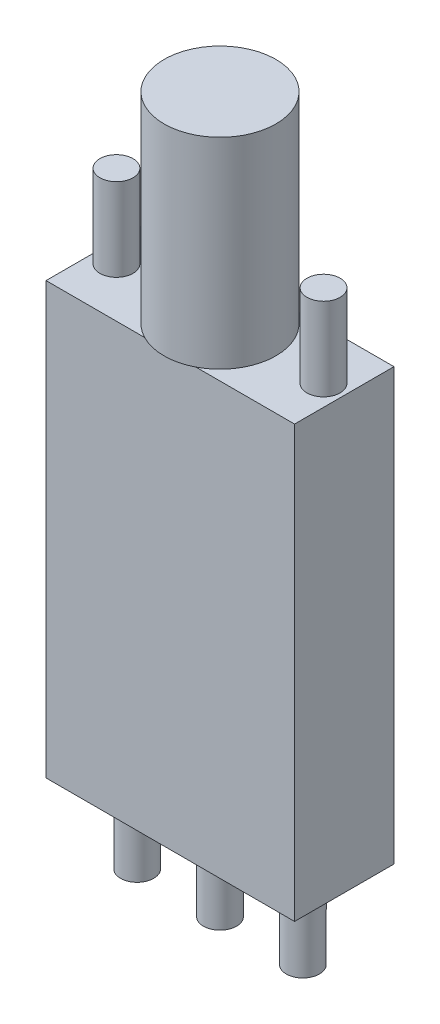
ISO-10303-21;
HEADER;
FILE_DESCRIPTION(('STEP AP214'),'2;1');
FILE_NAME('part.step','',(''),(''),'','','');
FILE_SCHEMA(('AUTOMOTIVE_DESIGN { 1 0 10303 214 1 1 1 1 }'));
ENDSEC;
DATA;
#1=APPLICATION_CONTEXT('core data for automotive mechanical design processes');
#2=APPLICATION_PROTOCOL_DEFINITION('international standard','automotive_design',2000,#1);
#3=PRODUCT_CONTEXT('',#1,'mechanical');
#4=PRODUCT('Part','Part','',(#3));
#5=PRODUCT_RELATED_PRODUCT_CATEGORY('part','',(#4));
#6=PRODUCT_DEFINITION_FORMATION('','',#4);
#7=PRODUCT_DEFINITION_CONTEXT('part definition',#1,'design');
#8=PRODUCT_DEFINITION('design','',#6,#7);
#9=PRODUCT_DEFINITION_SHAPE('','',#8);
#10=(LENGTH_UNIT() NAMED_UNIT(*) SI_UNIT(.MILLI.,.METRE.));
#11=(NAMED_UNIT(*) PLANE_ANGLE_UNIT() SI_UNIT($,.RADIAN.));
#12=(NAMED_UNIT(*) SI_UNIT($,.STERADIAN.) SOLID_ANGLE_UNIT());
#13=UNCERTAINTY_MEASURE_WITH_UNIT(LENGTH_MEASURE(1.E-05),#10,'distance_accuracy_value','');
#14=(GEOMETRIC_REPRESENTATION_CONTEXT(3) GLOBAL_UNCERTAINTY_ASSIGNED_CONTEXT((#13)) GLOBAL_UNIT_ASSIGNED_CONTEXT((#10,
#11,#12)) REPRESENTATION_CONTEXT('',''));
#15=CARTESIAN_POINT('',(0.,0.,0.));
#16=DIRECTION('',(0.,0.,1.));
#17=DIRECTION('',(1.,0.,0.));
#18=AXIS2_PLACEMENT_3D('',#15,#16,#17);
#19=CARTESIAN_POINT('',(-7.5,13.,6.));
#20=DIRECTION('',(0.,-1.,0.));
#21=DIRECTION('',(0.,0.,-1.));
#22=AXIS2_PLACEMENT_3D('',#19,#20,#21);
#23=PLANE('',#22);
#24=CARTESIAN_POINT('',(-6.25,13.,3.));
#25=DIRECTION('',(0.,-1.,0.));
#26=DIRECTION('',(0.,0.,-1.));
#27=AXIS2_PLACEMENT_3D('',#24,#25,#26);
#28=CIRCLE('',#27,1.);
#29=CARTESIAN_POINT('',(-6.25,13.,2.));
#30=VERTEX_POINT('',#29);
#31=EDGE_CURVE('E158',#30,#30,#28,.F.);
#32=ORIENTED_EDGE('',*,*,#31,.F.);
#33=EDGE_LOOP('',(#32));
#34=FACE_BOUND('',#33,.T.);
#35=CARTESIAN_POINT('',(0.,13.,3.));
#36=DIRECTION('',(0.,1.,0.));
#37=DIRECTION('',(0.,0.,1.));
#38=AXIS2_PLACEMENT_3D('',#35,#36,#37);
#39=CIRCLE('',#38,3.375);
#40=CARTESIAN_POINT('',(-1.54616460960662,13.,0.));
#41=VERTEX_POINT('',#40);
#42=CARTESIAN_POINT('',(-1.54616460960663,13.,6.));
#43=VERTEX_POINT('',#42);
#44=EDGE_CURVE('E101',#41,#43,#39,.T.);
#45=ORIENTED_EDGE('',*,*,#44,.F.);
#46=DIRECTION('',(-1.,0.,0.));
#47=VECTOR('',#46,1.);
#48=CARTESIAN_POINT('',(-7.5,13.,0.));
#49=LINE('',#48,#47);
#50=CARTESIAN_POINT('',(-7.5,13.,0.));
#51=VERTEX_POINT('',#50);
#52=EDGE_CURVE('E89',#41,#51,#49,.T.);
#53=ORIENTED_EDGE('',*,*,#52,.T.);
#54=DIRECTION('',(0.,0.,-1.));
#55=VECTOR('',#54,1.);
#56=CARTESIAN_POINT('',(-7.5,13.,6.));
#57=LINE('',#56,#55);
#58=CARTESIAN_POINT('',(-7.5,13.,6.));
#59=VERTEX_POINT('',#58);
#60=EDGE_CURVE('E153',#59,#51,#57,.T.);
#61=ORIENTED_EDGE('',*,*,#60,.F.);
#62=DIRECTION('',(-1.,0.,0.));
#63=VECTOR('',#62,1.);
#64=CARTESIAN_POINT('',(-7.5,13.,6.));
#65=LINE('',#64,#63);
#66=EDGE_CURVE('E50',#43,#59,#65,.T.);
#67=ORIENTED_EDGE('',*,*,#66,.F.);
#68=EDGE_LOOP('',(#45,#53,#61,#67));
#69=FACE_BOUND('',#68,.T.);
#70=ADVANCED_FACE('F35',(#34,#69),#23,.F.);
#71=CARTESIAN_POINT('',(6.25,13.,3.));
#72=DIRECTION('',(0.,-1.,0.));
#73=DIRECTION('',(0.,0.,-1.));
#74=AXIS2_PLACEMENT_3D('',#71,#72,#73);
#75=CIRCLE('',#74,1.);
#76=CARTESIAN_POINT('',(6.25,13.,2.));
#77=VERTEX_POINT('',#76);
#78=EDGE_CURVE('E161',#77,#77,#75,.F.);
#79=ORIENTED_EDGE('',*,*,#78,.F.);
#80=EDGE_LOOP('',(#79));
#81=FACE_BOUND('',#80,.T.);
#82=CARTESIAN_POINT('',(1.54616460960663,13.,6.));
#83=VERTEX_POINT('',#82);
#84=CARTESIAN_POINT('',(1.54616460960662,13.,0.));
#85=VERTEX_POINT('',#84);
#86=EDGE_CURVE('E58',#83,#85,#39,.T.);
#87=ORIENTED_EDGE('',*,*,#86,.F.);
#88=CARTESIAN_POINT('',(7.5,13.,6.));
#89=VERTEX_POINT('',#88);
#90=EDGE_CURVE('E137',#89,#83,#65,.T.);
#91=ORIENTED_EDGE('',*,*,#90,.F.);
#92=DIRECTION('',(0.,0.,-1.));
#93=VECTOR('',#92,1.);
#94=CARTESIAN_POINT('',(7.5,13.,6.));
#95=LINE('',#94,#93);
#96=CARTESIAN_POINT('',(7.5,13.,0.));
#97=VERTEX_POINT('',#96);
#98=EDGE_CURVE('E155',#89,#97,#95,.T.);
#99=ORIENTED_EDGE('',*,*,#98,.T.);
#100=EDGE_CURVE('E99',#97,#85,#49,.T.);
#101=ORIENTED_EDGE('',*,*,#100,.T.);
#102=EDGE_LOOP('',(#87,#91,#99,#101));
#103=FACE_BOUND('',#102,.T.);
#104=ADVANCED_FACE('F174',(#81,#103),#23,.F.);
#105=CARTESIAN_POINT('',(-7.5,-13.,6.));
#106=DIRECTION('',(0.,1.,0.));
#107=DIRECTION('',(0.,0.,1.));
#108=AXIS2_PLACEMENT_3D('',#105,#106,#107);
#109=PLANE('',#108);
#110=CARTESIAN_POINT('',(5.,-13.,3.00000000000007));
#111=DIRECTION('',(0.,1.,0.));
#112=DIRECTION('',(0.,0.,1.));
#113=AXIS2_PLACEMENT_3D('',#110,#111,#112);
#114=CIRCLE('',#113,1.);
#115=CARTESIAN_POINT('',(5.,-13.,4.00000000000007));
#116=VERTEX_POINT('',#115);
#117=EDGE_CURVE('E43',#116,#116,#114,.F.);
#118=ORIENTED_EDGE('',*,*,#117,.F.);
#119=EDGE_LOOP('',(#118));
#120=FACE_BOUND('',#119,.T.);
#121=DIRECTION('',(1.,0.,0.));
#122=VECTOR('',#121,1.);
#123=CARTESIAN_POINT('',(-7.5,-13.,0.));
#124=LINE('',#123,#122);
#125=CARTESIAN_POINT('',(-7.5,-13.,0.));
#126=VERTEX_POINT('',#125);
#127=CARTESIAN_POINT('',(7.5,-13.,0.));
#128=VERTEX_POINT('',#127);
#129=EDGE_CURVE('E136',#126,#128,#124,.T.);
#130=ORIENTED_EDGE('',*,*,#129,.T.);
#131=DIRECTION('',(0.,0.,-1.));
#132=VECTOR('',#131,1.);
#133=CARTESIAN_POINT('',(7.5,-13.,6.));
#134=LINE('',#133,#132);
#135=CARTESIAN_POINT('',(7.5,-13.,6.));
#136=VERTEX_POINT('',#135);
#137=EDGE_CURVE('E143',#136,#128,#134,.T.);
#138=ORIENTED_EDGE('',*,*,#137,.F.);
#139=DIRECTION('',(1.,0.,0.));
#140=VECTOR('',#139,1.);
#141=CARTESIAN_POINT('',(-7.5,-13.,6.));
#142=LINE('',#141,#140);
#143=CARTESIAN_POINT('',(-7.5,-13.,6.));
#144=VERTEX_POINT('',#143);
#145=EDGE_CURVE('E141',#144,#136,#142,.T.);
#146=ORIENTED_EDGE('',*,*,#145,.F.);
#147=DIRECTION('',(0.,0.,-1.));
#148=VECTOR('',#147,1.);
#149=CARTESIAN_POINT('',(-7.5,-13.,6.));
#150=LINE('',#149,#148);
#151=EDGE_CURVE('E150',#144,#126,#150,.T.);
#152=ORIENTED_EDGE('',*,*,#151,.T.);
#153=EDGE_LOOP('',(#130,#138,#146,#152));
#154=FACE_BOUND('',#153,.T.);
#155=CARTESIAN_POINT('',(0.,-13.,3.));
#156=DIRECTION('',(0.,1.,0.));
#157=DIRECTION('',(0.,0.,1.));
#158=AXIS2_PLACEMENT_3D('',#155,#156,#157);
#159=CIRCLE('',#158,1.);
#160=CARTESIAN_POINT('',(0.,-13.,4.));
#161=VERTEX_POINT('',#160);
#162=EDGE_CURVE('E164',#161,#161,#159,.F.);
#163=ORIENTED_EDGE('',*,*,#162,.F.);
#164=EDGE_LOOP('',(#163));
#165=FACE_BOUND('',#164,.T.);
#166=CARTESIAN_POINT('',(-5.,-13.,2.99999999999996));
#167=DIRECTION('',(0.,1.,0.));
#168=DIRECTION('',(0.,0.,1.));
#169=AXIS2_PLACEMENT_3D('',#166,#167,#168);
#170=CIRCLE('',#169,1.);
#171=CARTESIAN_POINT('',(-5.,-13.,3.99999999999996));
#172=VERTEX_POINT('',#171);
#173=EDGE_CURVE('E11',#172,#172,#170,.F.);
#174=ORIENTED_EDGE('',*,*,#173,.F.);
#175=EDGE_LOOP('',(#174));
#176=FACE_BOUND('',#175,.T.);
#177=ADVANCED_FACE('F171',(#120,#154,#165,#176),#109,.F.);
#178=CARTESIAN_POINT('',(7.5,-13.,6.));
#179=DIRECTION('',(-1.,0.,0.));
#180=DIRECTION('',(0.,0.,1.));
#181=AXIS2_PLACEMENT_3D('',#178,#179,#180);
#182=PLANE('',#181);
#183=DIRECTION('',(0.,1.,0.));
#184=VECTOR('',#183,1.);
#185=CARTESIAN_POINT('',(7.5,-13.,0.));
#186=LINE('',#185,#184);
#187=EDGE_CURVE('E97',#128,#97,#186,.T.);
#188=ORIENTED_EDGE('',*,*,#187,.T.);
#189=ORIENTED_EDGE('',*,*,#98,.F.);
#190=DIRECTION('',(0.,1.,0.));
#191=VECTOR('',#190,1.);
#192=CARTESIAN_POINT('',(7.5,-13.,6.));
#193=LINE('',#192,#191);
#194=EDGE_CURVE('E133',#136,#89,#193,.T.);
#195=ORIENTED_EDGE('',*,*,#194,.F.);
#196=ORIENTED_EDGE('',*,*,#137,.T.);
#197=EDGE_LOOP('',(#188,#189,#195,#196));
#198=FACE_BOUND('',#197,.T.);
#199=ADVANCED_FACE('F37',(#198),#182,.F.);
#200=CARTESIAN_POINT('',(-7.5,-13.,6.));
#201=DIRECTION('',(1.,0.,0.));
#202=DIRECTION('',(0.,0.,-1.));
#203=AXIS2_PLACEMENT_3D('',#200,#201,#202);
#204=PLANE('',#203);
#205=DIRECTION('',(0.,-1.,0.));
#206=VECTOR('',#205,1.);
#207=CARTESIAN_POINT('',(-7.5,-13.,0.));
#208=LINE('',#207,#206);
#209=EDGE_CURVE('E95',#51,#126,#208,.T.);
#210=ORIENTED_EDGE('',*,*,#209,.T.);
#211=ORIENTED_EDGE('',*,*,#151,.F.);
#212=DIRECTION('',(0.,-1.,0.));
#213=VECTOR('',#212,1.);
#214=CARTESIAN_POINT('',(-7.5,-13.,6.));
#215=LINE('',#214,#213);
#216=EDGE_CURVE('E139',#59,#144,#215,.T.);
#217=ORIENTED_EDGE('',*,*,#216,.F.);
#218=ORIENTED_EDGE('',*,*,#60,.T.);
#219=EDGE_LOOP('',(#210,#211,#217,#218));
#220=FACE_BOUND('',#219,.T.);
#221=ADVANCED_FACE('F207',(#220),#204,.F.);
#222=CARTESIAN_POINT('',(0.,0.,6.));
#223=DIRECTION('',(0.,0.,-1.));
#224=DIRECTION('',(-1.,0.,0.));
#225=AXIS2_PLACEMENT_3D('',#222,#223,#224);
#226=PLANE('',#225);
#227=ORIENTED_EDGE('',*,*,#194,.T.);
#228=ORIENTED_EDGE('',*,*,#90,.T.);
#229=DIRECTION('',(1.,0.,0.));
#230=VECTOR('',#229,1.);
#231=CARTESIAN_POINT('',(0.,13.,6.));
#232=LINE('',#231,#230);
#233=EDGE_CURVE('E115',#43,#83,#232,.T.);
#234=ORIENTED_EDGE('',*,*,#233,.F.);
#235=ORIENTED_EDGE('',*,*,#66,.T.);
#236=ORIENTED_EDGE('',*,*,#216,.T.);
#237=ORIENTED_EDGE('',*,*,#145,.T.);
#238=EDGE_LOOP('',(#227,#228,#234,#235,#236,#237));
#239=FACE_BOUND('',#238,.T.);
#240=ADVANCED_FACE('F209',(#239),#226,.F.);
#241=CARTESIAN_POINT('',(0.,0.,0.));
#242=DIRECTION('',(0.,0.,-1.));
#243=DIRECTION('',(-1.,0.,0.));
#244=AXIS2_PLACEMENT_3D('',#241,#242,#243);
#245=PLANE('',#244);
#246=ORIENTED_EDGE('',*,*,#187,.F.);
#247=ORIENTED_EDGE('',*,*,#129,.F.);
#248=ORIENTED_EDGE('',*,*,#209,.F.);
#249=ORIENTED_EDGE('',*,*,#52,.F.);
#250=EDGE_CURVE('E93',#85,#41,#49,.T.);
#251=ORIENTED_EDGE('',*,*,#250,.F.);
#252=ORIENTED_EDGE('',*,*,#100,.F.);
#253=EDGE_LOOP('',(#246,#247,#248,#249,#251,#252));
#254=FACE_BOUND('',#253,.T.);
#255=ADVANCED_FACE('F91',(#254),#245,.T.);
#256=CARTESIAN_POINT('',(-6.25,18.,3.));
#257=DIRECTION('',(0.,-1.,0.));
#258=DIRECTION('',(0.,0.,-1.));
#259=AXIS2_PLACEMENT_3D('',#256,#257,#258);
#260=CYLINDRICAL_SURFACE('',#259,1.);
#261=CARTESIAN_POINT('',(-6.25,18.,3.));
#262=DIRECTION('',(0.,1.,0.));
#263=DIRECTION('',(0.,0.,1.));
#264=AXIS2_PLACEMENT_3D('',#261,#262,#263);
#265=CIRCLE('',#264,1.);
#266=CARTESIAN_POINT('',(-6.25,18.,4.));
#267=VERTEX_POINT('',#266);
#268=EDGE_CURVE('E130',#267,#267,#265,.T.);
#269=ORIENTED_EDGE('',*,*,#268,.F.);
#270=EDGE_LOOP('',(#269));
#271=FACE_BOUND('',#270,.T.);
#272=ORIENTED_EDGE('',*,*,#31,.T.);
#273=EDGE_LOOP('',(#272));
#274=FACE_BOUND('',#273,.T.);
#275=ADVANCED_FACE('F214',(#271,#274),#260,.T.);
#276=CARTESIAN_POINT('',(-6.25,18.,3.));
#277=DIRECTION('',(0.,1.,0.));
#278=DIRECTION('',(0.,0.,1.));
#279=AXIS2_PLACEMENT_3D('',#276,#277,#278);
#280=PLANE('',#279);
#281=ORIENTED_EDGE('',*,*,#268,.T.);
#282=EDGE_LOOP('',(#281));
#283=FACE_BOUND('',#282,.T.);
#284=ADVANCED_FACE('F220',(#283),#280,.T.);
#285=CARTESIAN_POINT('',(6.25,18.,3.));
#286=DIRECTION('',(0.,-1.,0.));
#287=DIRECTION('',(0.,0.,-1.));
#288=AXIS2_PLACEMENT_3D('',#285,#286,#287);
#289=CYLINDRICAL_SURFACE('',#288,1.);
#290=CARTESIAN_POINT('',(6.25,18.,3.));
#291=DIRECTION('',(0.,1.,0.));
#292=DIRECTION('',(0.,0.,-1.));
#293=AXIS2_PLACEMENT_3D('',#290,#291,#292);
#294=CIRCLE('',#293,1.);
#295=CARTESIAN_POINT('',(6.25,18.,2.));
#296=VERTEX_POINT('',#295);
#297=EDGE_CURVE('E127',#296,#296,#294,.T.);
#298=ORIENTED_EDGE('',*,*,#297,.F.);
#299=EDGE_LOOP('',(#298));
#300=FACE_BOUND('',#299,.T.);
#301=ORIENTED_EDGE('',*,*,#78,.T.);
#302=EDGE_LOOP('',(#301));
#303=FACE_BOUND('',#302,.T.);
#304=ADVANCED_FACE('F224',(#300,#303),#289,.T.);
#305=CARTESIAN_POINT('',(6.25,18.,3.));
#306=DIRECTION('',(0.,-1.,0.));
#307=DIRECTION('',(0.,0.,-1.));
#308=AXIS2_PLACEMENT_3D('',#305,#306,#307);
#309=PLANE('',#308);
#310=ORIENTED_EDGE('',*,*,#297,.T.);
#311=EDGE_LOOP('',(#310));
#312=FACE_BOUND('',#311,.T.);
#313=ADVANCED_FACE('F228',(#312),#309,.F.);
#314=CARTESIAN_POINT('',(0.,-18.,3.));
#315=DIRECTION('',(0.,1.,0.));
#316=DIRECTION('',(0.,0.,1.));
#317=AXIS2_PLACEMENT_3D('',#314,#315,#316);
#318=CYLINDRICAL_SURFACE('',#317,1.);
#319=CARTESIAN_POINT('',(0.,-18.,3.));
#320=DIRECTION('',(0.,-1.,0.));
#321=DIRECTION('',(0.,0.,-1.));
#322=AXIS2_PLACEMENT_3D('',#319,#320,#321);
#323=CIRCLE('',#322,1.);
#324=CARTESIAN_POINT('',(0.,-18.,2.));
#325=VERTEX_POINT('',#324);
#326=EDGE_CURVE('E124',#325,#325,#323,.T.);
#327=ORIENTED_EDGE('',*,*,#326,.F.);
#328=EDGE_LOOP('',(#327));
#329=FACE_BOUND('',#328,.T.);
#330=ORIENTED_EDGE('',*,*,#162,.T.);
#331=EDGE_LOOP('',(#330));
#332=FACE_BOUND('',#331,.T.);
#333=ADVANCED_FACE('F232',(#329,#332),#318,.T.);
#334=CARTESIAN_POINT('',(0.,-18.,3.));
#335=DIRECTION('',(0.,-1.,0.));
#336=DIRECTION('',(0.,0.,-1.));
#337=AXIS2_PLACEMENT_3D('',#334,#335,#336);
#338=PLANE('',#337);
#339=ORIENTED_EDGE('',*,*,#326,.T.);
#340=EDGE_LOOP('',(#339));
#341=FACE_BOUND('',#340,.T.);
#342=ADVANCED_FACE('F236',(#341),#338,.T.);
#343=CARTESIAN_POINT('',(5.,-18.,3.00000000000007));
#344=DIRECTION('',(0.,1.,0.));
#345=DIRECTION('',(0.,0.,1.));
#346=AXIS2_PLACEMENT_3D('',#343,#344,#345);
#347=CYLINDRICAL_SURFACE('',#346,1.);
#348=CARTESIAN_POINT('',(5.,-18.,3.00000000000007));
#349=DIRECTION('',(0.,-1.,0.));
#350=DIRECTION('',(0.,0.,-1.));
#351=AXIS2_PLACEMENT_3D('',#348,#349,#350);
#352=CIRCLE('',#351,1.);
#353=CARTESIAN_POINT('',(5.,-18.,2.00000000000007));
#354=VERTEX_POINT('',#353);
#355=EDGE_CURVE('E121',#354,#354,#352,.T.);
#356=ORIENTED_EDGE('',*,*,#355,.F.);
#357=EDGE_LOOP('',(#356));
#358=FACE_BOUND('',#357,.T.);
#359=ORIENTED_EDGE('',*,*,#117,.T.);
#360=EDGE_LOOP('',(#359));
#361=FACE_BOUND('',#360,.T.);
#362=ADVANCED_FACE('F169',(#358,#361),#347,.T.);
#363=CARTESIAN_POINT('',(5.,-18.,3.00000000000007));
#364=DIRECTION('',(0.,-1.,0.));
#365=DIRECTION('',(0.,0.,-1.));
#366=AXIS2_PLACEMENT_3D('',#363,#364,#365);
#367=PLANE('',#366);
#368=ORIENTED_EDGE('',*,*,#355,.T.);
#369=EDGE_LOOP('',(#368));
#370=FACE_BOUND('',#369,.T.);
#371=ADVANCED_FACE('F185',(#370),#367,.T.);
#372=CARTESIAN_POINT('',(-5.,-18.,2.99999999999996));
#373=DIRECTION('',(0.,1.,0.));
#374=DIRECTION('',(0.,0.,1.));
#375=AXIS2_PLACEMENT_3D('',#372,#373,#374);
#376=CYLINDRICAL_SURFACE('',#375,1.);
#377=CARTESIAN_POINT('',(-5.,-18.,2.99999999999996));
#378=DIRECTION('',(0.,-1.,0.));
#379=DIRECTION('',(0.,0.,-1.));
#380=AXIS2_PLACEMENT_3D('',#377,#378,#379);
#381=CIRCLE('',#380,1.);
#382=CARTESIAN_POINT('',(-5.,-18.,1.99999999999997));
#383=VERTEX_POINT('',#382);
#384=EDGE_CURVE('E118',#383,#383,#381,.T.);
#385=ORIENTED_EDGE('',*,*,#384,.F.);
#386=EDGE_LOOP('',(#385));
#387=FACE_BOUND('',#386,.T.);
#388=ORIENTED_EDGE('',*,*,#173,.T.);
#389=EDGE_LOOP('',(#388));
#390=FACE_BOUND('',#389,.T.);
#391=ADVANCED_FACE('F182',(#387,#390),#376,.T.);
#392=CARTESIAN_POINT('',(-5.,-18.,2.99999999999996));
#393=DIRECTION('',(0.,-1.,0.));
#394=DIRECTION('',(0.,0.,-1.));
#395=AXIS2_PLACEMENT_3D('',#392,#393,#394);
#396=PLANE('',#395);
#397=ORIENTED_EDGE('',*,*,#384,.T.);
#398=EDGE_LOOP('',(#397));
#399=FACE_BOUND('',#398,.T.);
#400=ADVANCED_FACE('F184',(#399),#396,.T.);
#401=CARTESIAN_POINT('',(0.,13.,3.));
#402=DIRECTION('',(0.,1.,0.));
#403=DIRECTION('',(0.,0.,1.));
#404=AXIS2_PLACEMENT_3D('',#401,#402,#403);
#405=PLANE('',#404);
#406=EDGE_CURVE('E106',#43,#83,#39,.T.);
#407=ORIENTED_EDGE('',*,*,#406,.F.);
#408=ORIENTED_EDGE('',*,*,#233,.T.);
#409=EDGE_LOOP('',(#407,#408));
#410=FACE_BOUND('',#409,.T.);
#411=ADVANCED_FACE('F192',(#410),#405,.F.);
#412=CARTESIAN_POINT('',(0.,25.125,3.));
#413=DIRECTION('',(0.,-1.,0.));
#414=DIRECTION('',(0.,0.,-1.));
#415=AXIS2_PLACEMENT_3D('',#412,#413,#414);
#416=CYLINDRICAL_SURFACE('',#415,3.375);
#417=CARTESIAN_POINT('',(0.,25.125,3.));
#418=DIRECTION('',(0.,1.,0.));
#419=DIRECTION('',(0.,0.,1.));
#420=AXIS2_PLACEMENT_3D('',#417,#418,#419);
#421=CIRCLE('',#420,3.375);
#422=CARTESIAN_POINT('',(0.,25.125,6.375));
#423=VERTEX_POINT('',#422);
#424=EDGE_CURVE('E112',#423,#423,#421,.T.);
#425=ORIENTED_EDGE('',*,*,#424,.F.);
#426=EDGE_LOOP('',(#425));
#427=FACE_BOUND('',#426,.T.);
#428=ORIENTED_EDGE('',*,*,#86,.T.);
#429=EDGE_CURVE('E105',#85,#41,#39,.T.);
#430=ORIENTED_EDGE('',*,*,#429,.T.);
#431=ORIENTED_EDGE('',*,*,#44,.T.);
#432=ORIENTED_EDGE('',*,*,#406,.T.);
#433=EDGE_LOOP('',(#428,#430,#431,#432));
#434=FACE_BOUND('',#433,.T.);
#435=ADVANCED_FACE('F111',(#427,#434),#416,.T.);
#436=CARTESIAN_POINT('',(0.,25.125,3.));
#437=DIRECTION('',(0.,1.,0.));
#438=DIRECTION('',(0.,0.,1.));
#439=AXIS2_PLACEMENT_3D('',#436,#437,#438);
#440=PLANE('',#439);
#441=ORIENTED_EDGE('',*,*,#424,.T.);
#442=EDGE_LOOP('',(#441));
#443=FACE_BOUND('',#442,.T.);
#444=ADVANCED_FACE('F351',(#443),#440,.T.);
#445=ORIENTED_EDGE('',*,*,#250,.T.);
#446=ORIENTED_EDGE('',*,*,#429,.F.);
#447=EDGE_LOOP('',(#445,#446));
#448=FACE_BOUND('',#447,.T.);
#449=ADVANCED_FACE('F110',(#448),#405,.F.);
#450=CLOSED_SHELL('',(#70,#104,#177,#199,#221,#240,#255,#275,#284,#304,#313,#333,#342,#362,#371,
#391,#400,#411,#435,#444,#449));
#451=MANIFOLD_SOLID_BREP('B2',#450);
#452=ADVANCED_BREP_SHAPE_REPRESENTATION('',(#18,#451),#14);
#453=SHAPE_DEFINITION_REPRESENTATION(#9,#452);
ENDSEC;
END-ISO-10303-21;
